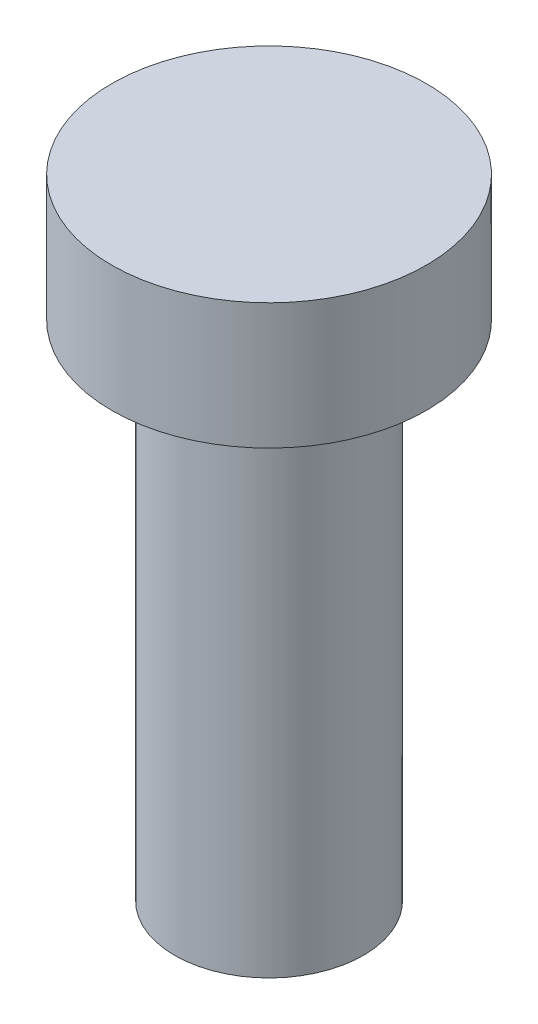
ISO-10303-21;
HEADER;
FILE_DESCRIPTION(('STEP AP214'),'2;1');
FILE_NAME('part.step','',(''),(''),'','','');
FILE_SCHEMA(('AUTOMOTIVE_DESIGN { 1 0 10303 214 1 1 1 1 }'));
ENDSEC;
DATA;
#1=APPLICATION_CONTEXT('core data for automotive mechanical design processes');
#2=APPLICATION_PROTOCOL_DEFINITION('international standard','automotive_design',2000,#1);
#3=PRODUCT_CONTEXT('',#1,'mechanical');
#4=PRODUCT('Part','Part','',(#3));
#5=PRODUCT_RELATED_PRODUCT_CATEGORY('part','',(#4));
#6=PRODUCT_DEFINITION_FORMATION('','',#4);
#7=PRODUCT_DEFINITION_CONTEXT('part definition',#1,'design');
#8=PRODUCT_DEFINITION('design','',#6,#7);
#9=PRODUCT_DEFINITION_SHAPE('','',#8);
#10=(LENGTH_UNIT() NAMED_UNIT(*) SI_UNIT(.MILLI.,.METRE.));
#11=(NAMED_UNIT(*) PLANE_ANGLE_UNIT() SI_UNIT($,.RADIAN.));
#12=(NAMED_UNIT(*) SI_UNIT($,.STERADIAN.) SOLID_ANGLE_UNIT());
#13=UNCERTAINTY_MEASURE_WITH_UNIT(LENGTH_MEASURE(1.E-05),#10,'distance_accuracy_value','');
#14=(GEOMETRIC_REPRESENTATION_CONTEXT(3) GLOBAL_UNCERTAINTY_ASSIGNED_CONTEXT((#13)) GLOBAL_UNIT_ASSIGNED_CONTEXT((#10,
#11,#12)) REPRESENTATION_CONTEXT('',''));
#15=CARTESIAN_POINT('',(0.,0.,0.));
#16=DIRECTION('',(0.,0.,1.));
#17=DIRECTION('',(1.,0.,0.));
#18=AXIS2_PLACEMENT_3D('',#15,#16,#17);
#19=CARTESIAN_POINT('',(0.,8.,0.));
#20=DIRECTION('',(0.,-1.,0.));
#21=DIRECTION('',(0.,0.,-1.));
#22=AXIS2_PLACEMENT_3D('',#19,#20,#21);
#23=CYLINDRICAL_SURFACE('',#22,1.5);
#24=CARTESIAN_POINT('',(0.,8.,0.));
#25=DIRECTION('',(0.,1.,0.));
#26=DIRECTION('',(0.,0.,1.));
#27=AXIS2_PLACEMENT_3D('',#24,#25,#26);
#28=CIRCLE('',#27,1.5);
#29=CARTESIAN_POINT('',(0.,8.,1.5));
#30=VERTEX_POINT('',#29);
#31=EDGE_CURVE('E10',#30,#30,#28,.T.);
#32=ORIENTED_EDGE('',*,*,#31,.F.);
#33=EDGE_LOOP('',(#32));
#34=FACE_BOUND('',#33,.T.);
#35=CARTESIAN_POINT('',(0.,0.,0.));
#36=DIRECTION('',(0.,1.,0.));
#37=DIRECTION('',(0.,0.,1.));
#38=AXIS2_PLACEMENT_3D('',#35,#36,#37);
#39=CIRCLE('',#38,1.5);
#40=CARTESIAN_POINT('',(0.,0.,1.5));
#41=VERTEX_POINT('',#40);
#42=EDGE_CURVE('E38',#41,#41,#39,.T.);
#43=ORIENTED_EDGE('',*,*,#42,.T.);
#44=EDGE_LOOP('',(#43));
#45=FACE_BOUND('',#44,.T.);
#46=ADVANCED_FACE('F35',(#34,#45),#23,.T.);
#47=CARTESIAN_POINT('',(0.,0.,0.));
#48=DIRECTION('',(0.,1.,0.));
#49=DIRECTION('',(0.,0.,1.));
#50=AXIS2_PLACEMENT_3D('',#47,#48,#49);
#51=PLANE('',#50);
#52=ORIENTED_EDGE('',*,*,#42,.F.);
#53=EDGE_LOOP('',(#52));
#54=FACE_BOUND('',#53,.T.);
#55=ADVANCED_FACE('F58',(#54),#51,.F.);
#56=CARTESIAN_POINT('',(0.,10.,0.));
#57=DIRECTION('',(0.,-1.,0.));
#58=DIRECTION('',(0.,0.,-1.));
#59=AXIS2_PLACEMENT_3D('',#56,#57,#58);
#60=CYLINDRICAL_SURFACE('',#59,2.5);
#61=CARTESIAN_POINT('',(0.,10.,0.));
#62=DIRECTION('',(0.,1.,0.));
#63=DIRECTION('',(0.,0.,1.));
#64=AXIS2_PLACEMENT_3D('',#61,#62,#63);
#65=CIRCLE('',#64,2.5);
#66=CARTESIAN_POINT('',(0.,10.,2.5));
#67=VERTEX_POINT('',#66);
#68=EDGE_CURVE('E45',#67,#67,#65,.T.);
#69=ORIENTED_EDGE('',*,*,#68,.F.);
#70=EDGE_LOOP('',(#69));
#71=FACE_BOUND('',#70,.T.);
#72=CARTESIAN_POINT('',(0.,8.,0.));
#73=DIRECTION('',(0.,1.,0.));
#74=DIRECTION('',(0.,0.,1.));
#75=AXIS2_PLACEMENT_3D('',#72,#73,#74);
#76=CIRCLE('',#75,2.5);
#77=CARTESIAN_POINT('',(0.,8.,2.5));
#78=VERTEX_POINT('',#77);
#79=EDGE_CURVE('E47',#78,#78,#76,.T.);
#80=ORIENTED_EDGE('',*,*,#79,.T.);
#81=EDGE_LOOP('',(#80));
#82=FACE_BOUND('',#81,.T.);
#83=ADVANCED_FACE('F55',(#71,#82),#60,.T.);
#84=CARTESIAN_POINT('',(0.,10.,0.));
#85=DIRECTION('',(0.,1.,0.));
#86=DIRECTION('',(0.,0.,1.));
#87=AXIS2_PLACEMENT_3D('',#84,#85,#86);
#88=PLANE('',#87);
#89=ORIENTED_EDGE('',*,*,#68,.T.);
#90=EDGE_LOOP('',(#89));
#91=FACE_BOUND('',#90,.T.);
#92=ADVANCED_FACE('F53',(#91),#88,.T.);
#93=CARTESIAN_POINT('',(0.,8.,0.));
#94=DIRECTION('',(0.,1.,0.));
#95=DIRECTION('',(0.,0.,1.));
#96=AXIS2_PLACEMENT_3D('',#93,#94,#95);
#97=PLANE('',#96);
#98=ORIENTED_EDGE('',*,*,#31,.T.);
#99=EDGE_LOOP('',(#98));
#100=FACE_BOUND('',#99,.T.);
#101=ORIENTED_EDGE('',*,*,#79,.F.);
#102=EDGE_LOOP('',(#101));
#103=FACE_BOUND('',#102,.T.);
#104=ADVANCED_FACE('F62',(#100,#103),#97,.F.);
#105=CLOSED_SHELL('',(#46,#55,#83,#92,#104));
#106=MANIFOLD_SOLID_BREP('B2',#105);
#107=ADVANCED_BREP_SHAPE_REPRESENTATION('',(#18,#106),#14);
#108=SHAPE_DEFINITION_REPRESENTATION(#9,#107);
ENDSEC;
END-ISO-10303-21;
